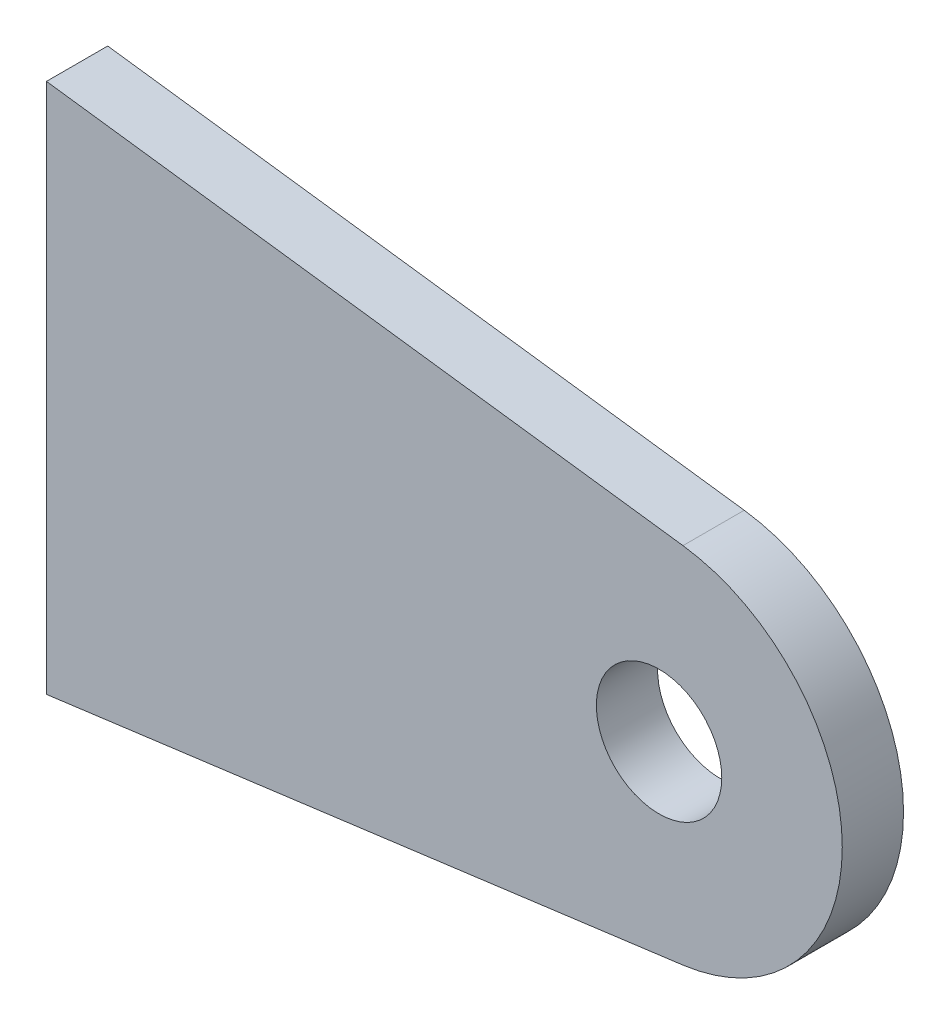
ISO-10303-21;
HEADER;
FILE_DESCRIPTION(('STEP AP214'),'2;1');
FILE_NAME('part.step','',(''),(''),'','','');
FILE_SCHEMA(('AUTOMOTIVE_DESIGN { 1 0 10303 214 1 1 1 1 }'));
ENDSEC;
DATA;
#1=APPLICATION_CONTEXT('core data for automotive mechanical design processes');
#2=APPLICATION_PROTOCOL_DEFINITION('international standard','automotive_design',2000,#1);
#3=PRODUCT_CONTEXT('',#1,'mechanical');
#4=PRODUCT('Part','Part','',(#3));
#5=PRODUCT_RELATED_PRODUCT_CATEGORY('part','',(#4));
#6=PRODUCT_DEFINITION_FORMATION('','',#4);
#7=PRODUCT_DEFINITION_CONTEXT('part definition',#1,'design');
#8=PRODUCT_DEFINITION('design','',#6,#7);
#9=PRODUCT_DEFINITION_SHAPE('','',#8);
#10=(LENGTH_UNIT() NAMED_UNIT(*) SI_UNIT(.MILLI.,.METRE.));
#11=(NAMED_UNIT(*) PLANE_ANGLE_UNIT() SI_UNIT($,.RADIAN.));
#12=(NAMED_UNIT(*) SI_UNIT($,.STERADIAN.) SOLID_ANGLE_UNIT());
#13=UNCERTAINTY_MEASURE_WITH_UNIT(LENGTH_MEASURE(1.E-05),#10,'distance_accuracy_value','');
#14=(GEOMETRIC_REPRESENTATION_CONTEXT(3) GLOBAL_UNCERTAINTY_ASSIGNED_CONTEXT((#13)) GLOBAL_UNIT_ASSIGNED_CONTEXT((#10,
#11,#12)) REPRESENTATION_CONTEXT('',''));
#15=CARTESIAN_POINT('',(0.,0.,0.));
#16=DIRECTION('',(0.,0.,1.));
#17=DIRECTION('',(1.,0.,0.));
#18=AXIS2_PLACEMENT_3D('',#15,#16,#17);
#19=CARTESIAN_POINT('',(1.23946787290706,-9.41469319322447,3.17499999999981));
#20=DIRECTION('',(0.130526192220052,-0.99144486137381,0.));
#21=DIRECTION('',(0.99144486137381,0.130526192220052,0.));
#22=AXIS2_PLACEMENT_3D('',#19,#20,#21);
#23=PLANE('',#22);
#24=DIRECTION('',(-0.99144486137381,-0.130526192220052,0.));
#25=VECTOR('',#24,1.);
#26=CARTESIAN_POINT('',(1.23946787290706,-9.41469319322447,-1.94289029309402E-13));
#27=LINE('',#26,#25);
#28=CARTESIAN_POINT('',(1.23946787290707,-9.41469319322442,-1.94289029309402E-13));
#29=VERTEX_POINT('',#28);
#30=CARTESIAN_POINT('',(-31.7499999999999,-13.7578390327719,-1.94289029309402E-13));
#31=VERTEX_POINT('',#30);
#32=EDGE_CURVE('E104',#29,#31,#27,.T.);
#33=ORIENTED_EDGE('',*,*,#32,.F.);
#34=DIRECTION('',(0.,0.,-1.));
#35=VECTOR('',#34,1.);
#36=CARTESIAN_POINT('',(1.23946787290707,-9.41469319322442,3.17499999999981));
#37=LINE('',#36,#35);
#38=CARTESIAN_POINT('',(1.23946787290707,-9.41469319322442,3.17499999999981));
#39=VERTEX_POINT('',#38);
#40=EDGE_CURVE('E11',#39,#29,#37,.T.);
#41=ORIENTED_EDGE('',*,*,#40,.F.);
#42=DIRECTION('',(-0.99144486137381,-0.130526192220052,0.));
#43=VECTOR('',#42,1.);
#44=CARTESIAN_POINT('',(1.23946787290706,-9.41469319322447,3.17499999999981));
#45=LINE('',#44,#43);
#46=CARTESIAN_POINT('',(-31.7499999999999,-13.7578390327719,3.17499999999981));
#47=VERTEX_POINT('',#46);
#48=EDGE_CURVE('E86',#39,#47,#45,.T.);
#49=ORIENTED_EDGE('',*,*,#48,.T.);
#50=DIRECTION('',(0.,0.,-1.));
#51=VECTOR('',#50,1.);
#52=CARTESIAN_POINT('',(-31.7499999999999,-13.7578390327719,3.17499999999981));
#53=LINE('',#52,#51);
#54=EDGE_CURVE('E53',#47,#31,#53,.T.);
#55=ORIENTED_EDGE('',*,*,#54,.T.);
#56=EDGE_LOOP('',(#33,#41,#49,#55));
#57=FACE_BOUND('',#56,.T.);
#58=ADVANCED_FACE('F37',(#57),#23,.T.);
#59=CARTESIAN_POINT('',(0.,0.,3.17499999999981));
#60=DIRECTION('',(0.,0.,-1.));
#61=DIRECTION('',(-1.,0.,0.));
#62=AXIS2_PLACEMENT_3D('',#59,#60,#61);
#63=CYLINDRICAL_SURFACE('',#62,9.49593220966295);
#64=CARTESIAN_POINT('',(0.,0.,-1.94289029309402E-13));
#65=DIRECTION('',(0.,0.,1.));
#66=DIRECTION('',(1.,0.,0.));
#67=AXIS2_PLACEMENT_3D('',#64,#65,#66);
#68=CIRCLE('',#67,9.49593220966295);
#69=CARTESIAN_POINT('',(1.23946787290707,9.41469319322442,-1.94289029309402E-13));
#70=VERTEX_POINT('',#69);
#71=EDGE_CURVE('E92',#29,#70,#68,.T.);
#72=ORIENTED_EDGE('',*,*,#71,.T.);
#73=DIRECTION('',(0.,0.,-1.));
#74=VECTOR('',#73,1.);
#75=CARTESIAN_POINT('',(1.23946787290707,9.41469319322442,3.17499999999981));
#76=LINE('',#75,#74);
#77=CARTESIAN_POINT('',(1.23946787290707,9.41469319322442,3.17499999999981));
#78=VERTEX_POINT('',#77);
#79=EDGE_CURVE('E45',#78,#70,#76,.T.);
#80=ORIENTED_EDGE('',*,*,#79,.F.);
#81=CARTESIAN_POINT('',(0.,0.,3.17499999999981));
#82=DIRECTION('',(0.,0.,1.));
#83=DIRECTION('',(1.,0.,0.));
#84=AXIS2_PLACEMENT_3D('',#81,#82,#83);
#85=CIRCLE('',#84,9.49593220966295);
#86=EDGE_CURVE('E79',#39,#78,#85,.T.);
#87=ORIENTED_EDGE('',*,*,#86,.F.);
#88=ORIENTED_EDGE('',*,*,#40,.T.);
#89=EDGE_LOOP('',(#72,#80,#87,#88));
#90=FACE_BOUND('',#89,.T.);
#91=ADVANCED_FACE('F90',(#90),#63,.T.);
#92=CARTESIAN_POINT('',(1.23946787290706,9.41469319322445,3.17499999999981));
#93=DIRECTION('',(-0.130526192220052,-0.99144486137381,0.));
#94=DIRECTION('',(0.99144486137381,-0.130526192220052,0.));
#95=AXIS2_PLACEMENT_3D('',#92,#93,#94);
#96=PLANE('',#95);
#97=DIRECTION('',(-0.99144486137381,0.130526192220052,0.));
#98=VECTOR('',#97,1.);
#99=CARTESIAN_POINT('',(1.23946787290706,9.41469319322445,-1.94289029309402E-13));
#100=LINE('',#99,#98);
#101=CARTESIAN_POINT('',(-31.7499999999999,13.7578390327718,-1.94289029309402E-13));
#102=VERTEX_POINT('',#101);
#103=EDGE_CURVE('E107',#70,#102,#100,.T.);
#104=ORIENTED_EDGE('',*,*,#103,.T.);
#105=DIRECTION('',(0.,0.,-1.));
#106=VECTOR('',#105,1.);
#107=CARTESIAN_POINT('',(-31.7499999999999,13.7578390327718,3.17499999999981));
#108=LINE('',#107,#106);
#109=CARTESIAN_POINT('',(-31.7499999999999,13.7578390327718,3.17499999999981));
#110=VERTEX_POINT('',#109);
#111=EDGE_CURVE('E67',#110,#102,#108,.T.);
#112=ORIENTED_EDGE('',*,*,#111,.F.);
#113=DIRECTION('',(-0.99144486137381,0.130526192220052,0.));
#114=VECTOR('',#113,1.);
#115=CARTESIAN_POINT('',(1.23946787290706,9.41469319322445,3.17499999999981));
#116=LINE('',#115,#114);
#117=EDGE_CURVE('E85',#78,#110,#116,.T.);
#118=ORIENTED_EDGE('',*,*,#117,.F.);
#119=ORIENTED_EDGE('',*,*,#79,.T.);
#120=EDGE_LOOP('',(#104,#112,#118,#119));
#121=FACE_BOUND('',#120,.T.);
#122=ADVANCED_FACE('F95',(#121),#96,.F.);
#123=CARTESIAN_POINT('',(-31.7499999999999,0.,3.17499999999981));
#124=DIRECTION('',(-1.,0.,0.));
#125=DIRECTION('',(0.,0.,1.));
#126=AXIS2_PLACEMENT_3D('',#123,#124,#125);
#127=PLANE('',#126);
#128=DIRECTION('',(0.,1.,0.));
#129=VECTOR('',#128,1.);
#130=CARTESIAN_POINT('',(-31.7499999999999,0.,-1.94289029309402E-13));
#131=LINE('',#130,#129);
#132=EDGE_CURVE('E109',#31,#102,#131,.T.);
#133=ORIENTED_EDGE('',*,*,#132,.F.);
#134=ORIENTED_EDGE('',*,*,#54,.F.);
#135=DIRECTION('',(0.,1.,0.));
#136=VECTOR('',#135,1.);
#137=CARTESIAN_POINT('',(-31.7499999999999,0.,3.17499999999981));
#138=LINE('',#137,#136);
#139=EDGE_CURVE('E96',#47,#110,#138,.T.);
#140=ORIENTED_EDGE('',*,*,#139,.T.);
#141=ORIENTED_EDGE('',*,*,#111,.T.);
#142=EDGE_LOOP('',(#133,#134,#140,#141));
#143=FACE_BOUND('',#142,.T.);
#144=ADVANCED_FACE('F118',(#143),#127,.T.);
#145=CARTESIAN_POINT('',(0.,0.,3.17499999999981));
#146=DIRECTION('',(0.,0.,-1.));
#147=DIRECTION('',(-1.,0.,0.));
#148=AXIS2_PLACEMENT_3D('',#145,#146,#147);
#149=CYLINDRICAL_SURFACE('',#148,3.24999999999995);
#150=CARTESIAN_POINT('',(0.,0.,3.17499999999981));
#151=DIRECTION('',(0.,0.,1.));
#152=DIRECTION('',(1.,0.,0.));
#153=AXIS2_PLACEMENT_3D('',#150,#151,#152);
#154=CIRCLE('',#153,3.24999999999995);
#155=CARTESIAN_POINT('',(3.24999999999995,0.,3.17499999999981));
#156=VERTEX_POINT('',#155);
#157=EDGE_CURVE('E98',#156,#156,#154,.T.);
#158=ORIENTED_EDGE('',*,*,#157,.T.);
#159=EDGE_LOOP('',(#158));
#160=FACE_BOUND('',#159,.T.);
#161=CARTESIAN_POINT('',(0.,0.,-1.94289029309402E-13));
#162=DIRECTION('',(0.,0.,1.));
#163=DIRECTION('',(1.,0.,0.));
#164=AXIS2_PLACEMENT_3D('',#161,#162,#163);
#165=CIRCLE('',#164,3.24999999999995);
#166=CARTESIAN_POINT('',(3.24999999999995,0.,-1.94289029309402E-13));
#167=VERTEX_POINT('',#166);
#168=EDGE_CURVE('E112',#167,#167,#165,.T.);
#169=ORIENTED_EDGE('',*,*,#168,.F.);
#170=EDGE_LOOP('',(#169));
#171=FACE_BOUND('',#170,.T.);
#172=ADVANCED_FACE('F120',(#160,#171),#149,.F.);
#173=CARTESIAN_POINT('',(0.,0.,3.17499999999981));
#174=DIRECTION('',(0.,0.,1.));
#175=DIRECTION('',(1.,0.,0.));
#176=AXIS2_PLACEMENT_3D('',#173,#174,#175);
#177=PLANE('',#176);
#178=ORIENTED_EDGE('',*,*,#48,.F.);
#179=ORIENTED_EDGE('',*,*,#86,.T.);
#180=ORIENTED_EDGE('',*,*,#117,.T.);
#181=ORIENTED_EDGE('',*,*,#139,.F.);
#182=EDGE_LOOP('',(#178,#179,#180,#181));
#183=FACE_BOUND('',#182,.T.);
#184=ORIENTED_EDGE('',*,*,#157,.F.);
#185=EDGE_LOOP('',(#184));
#186=FACE_BOUND('',#185,.T.);
#187=ADVANCED_FACE('F81',(#183,#186),#177,.T.);
#188=CARTESIAN_POINT('',(0.,0.,-1.94289029309402E-13));
#189=DIRECTION('',(0.,0.,1.));
#190=DIRECTION('',(1.,0.,0.));
#191=AXIS2_PLACEMENT_3D('',#188,#189,#190);
#192=PLANE('',#191);
#193=ORIENTED_EDGE('',*,*,#32,.T.);
#194=ORIENTED_EDGE('',*,*,#132,.T.);
#195=ORIENTED_EDGE('',*,*,#103,.F.);
#196=ORIENTED_EDGE('',*,*,#71,.F.);
#197=EDGE_LOOP('',(#193,#194,#195,#196));
#198=FACE_BOUND('',#197,.T.);
#199=ORIENTED_EDGE('',*,*,#168,.T.);
#200=EDGE_LOOP('',(#199));
#201=FACE_BOUND('',#200,.T.);
#202=ADVANCED_FACE('F159',(#198,#201),#192,.F.);
#203=CLOSED_SHELL('',(#58,#91,#122,#144,#172,#187,#202));
#204=MANIFOLD_SOLID_BREP('B2',#203);
#205=ADVANCED_BREP_SHAPE_REPRESENTATION('',(#18,#204),#14);
#206=SHAPE_DEFINITION_REPRESENTATION(#9,#205);
ENDSEC;
END-ISO-10303-21;
